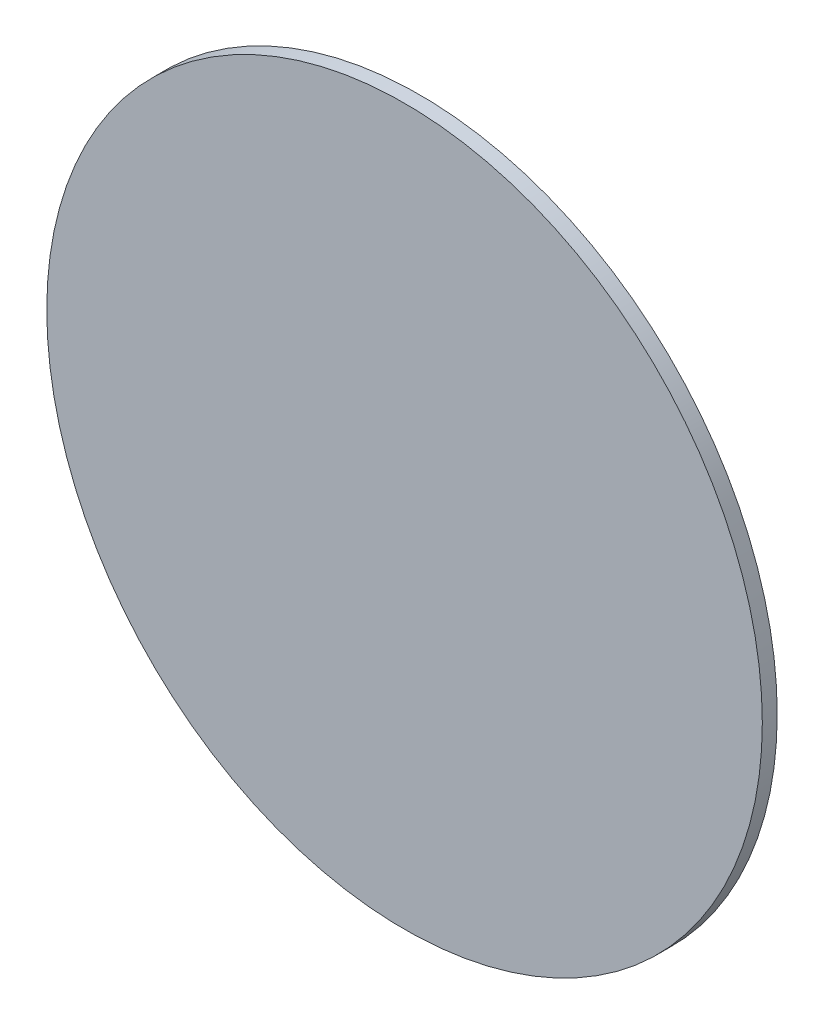
ISO-10303-21;
HEADER;
FILE_DESCRIPTION(('STEP AP214'),'2;1');
FILE_NAME('part.step','',(''),(''),'','','');
FILE_SCHEMA(('AUTOMOTIVE_DESIGN { 1 0 10303 214 1 1 1 1 }'));
ENDSEC;
DATA;
#1=APPLICATION_CONTEXT('core data for automotive mechanical design processes');
#2=APPLICATION_PROTOCOL_DEFINITION('international standard','automotive_design',2000,#1);
#3=PRODUCT_CONTEXT('',#1,'mechanical');
#4=PRODUCT('Part','Part','',(#3));
#5=PRODUCT_RELATED_PRODUCT_CATEGORY('part','',(#4));
#6=PRODUCT_DEFINITION_FORMATION('','',#4);
#7=PRODUCT_DEFINITION_CONTEXT('part definition',#1,'design');
#8=PRODUCT_DEFINITION('design','',#6,#7);
#9=PRODUCT_DEFINITION_SHAPE('','',#8);
#10=(LENGTH_UNIT() NAMED_UNIT(*) SI_UNIT(.MILLI.,.METRE.));
#11=(NAMED_UNIT(*) PLANE_ANGLE_UNIT() SI_UNIT($,.RADIAN.));
#12=(NAMED_UNIT(*) SI_UNIT($,.STERADIAN.) SOLID_ANGLE_UNIT());
#13=UNCERTAINTY_MEASURE_WITH_UNIT(LENGTH_MEASURE(1.E-05),#10,'distance_accuracy_value','');
#14=(GEOMETRIC_REPRESENTATION_CONTEXT(3) GLOBAL_UNCERTAINTY_ASSIGNED_CONTEXT((#13)) GLOBAL_UNIT_ASSIGNED_CONTEXT((#10,
#11,#12)) REPRESENTATION_CONTEXT('',''));
#15=CARTESIAN_POINT('',(0.,0.,0.));
#16=DIRECTION('',(0.,0.,1.));
#17=DIRECTION('',(1.,0.,0.));
#18=AXIS2_PLACEMENT_3D('',#15,#16,#17);
#19=CARTESIAN_POINT('',(0.,0.,1.));
#20=DIRECTION('',(0.,0.,-1.));
#21=DIRECTION('',(-1.,0.,0.));
#22=AXIS2_PLACEMENT_3D('',#19,#20,#21);
#23=CYLINDRICAL_SURFACE('',#22,24.);
#24=CARTESIAN_POINT('',(0.,0.,1.));
#25=DIRECTION('',(0.,0.,1.));
#26=DIRECTION('',(1.,0.,0.));
#27=AXIS2_PLACEMENT_3D('',#24,#25,#26);
#28=CIRCLE('',#27,24.);
#29=CARTESIAN_POINT('',(24.,0.,1.));
#30=VERTEX_POINT('',#29);
#31=EDGE_CURVE('E10',#30,#30,#28,.T.);
#32=ORIENTED_EDGE('',*,*,#31,.F.);
#33=EDGE_LOOP('',(#32));
#34=FACE_BOUND('',#33,.T.);
#35=CARTESIAN_POINT('',(0.,0.,0.));
#36=DIRECTION('',(0.,0.,1.));
#37=DIRECTION('',(1.,0.,0.));
#38=AXIS2_PLACEMENT_3D('',#35,#36,#37);
#39=CIRCLE('',#38,24.);
#40=CARTESIAN_POINT('',(24.,0.,0.));
#41=VERTEX_POINT('',#40);
#42=EDGE_CURVE('E36',#41,#41,#39,.T.);
#43=ORIENTED_EDGE('',*,*,#42,.T.);
#44=EDGE_LOOP('',(#43));
#45=FACE_BOUND('',#44,.T.);
#46=ADVANCED_FACE('F33',(#34,#45),#23,.T.);
#47=CARTESIAN_POINT('',(0.,0.,1.));
#48=DIRECTION('',(0.,0.,1.));
#49=DIRECTION('',(1.,0.,0.));
#50=AXIS2_PLACEMENT_3D('',#47,#48,#49);
#51=PLANE('',#50);
#52=ORIENTED_EDGE('',*,*,#31,.T.);
#53=EDGE_LOOP('',(#52));
#54=FACE_BOUND('',#53,.T.);
#55=ADVANCED_FACE('F48',(#54),#51,.T.);
#56=CARTESIAN_POINT('',(0.,0.,0.));
#57=DIRECTION('',(0.,0.,1.));
#58=DIRECTION('',(1.,0.,0.));
#59=AXIS2_PLACEMENT_3D('',#56,#57,#58);
#60=PLANE('',#59);
#61=ORIENTED_EDGE('',*,*,#42,.F.);
#62=EDGE_LOOP('',(#61));
#63=FACE_BOUND('',#62,.T.);
#64=ADVANCED_FACE('F46',(#63),#60,.F.);
#65=CLOSED_SHELL('',(#46,#55,#64));
#66=MANIFOLD_SOLID_BREP('B2',#65);
#67=ADVANCED_BREP_SHAPE_REPRESENTATION('',(#18,#66),#14);
#68=SHAPE_DEFINITION_REPRESENTATION(#9,#67);
ENDSEC;
END-ISO-10303-21;
